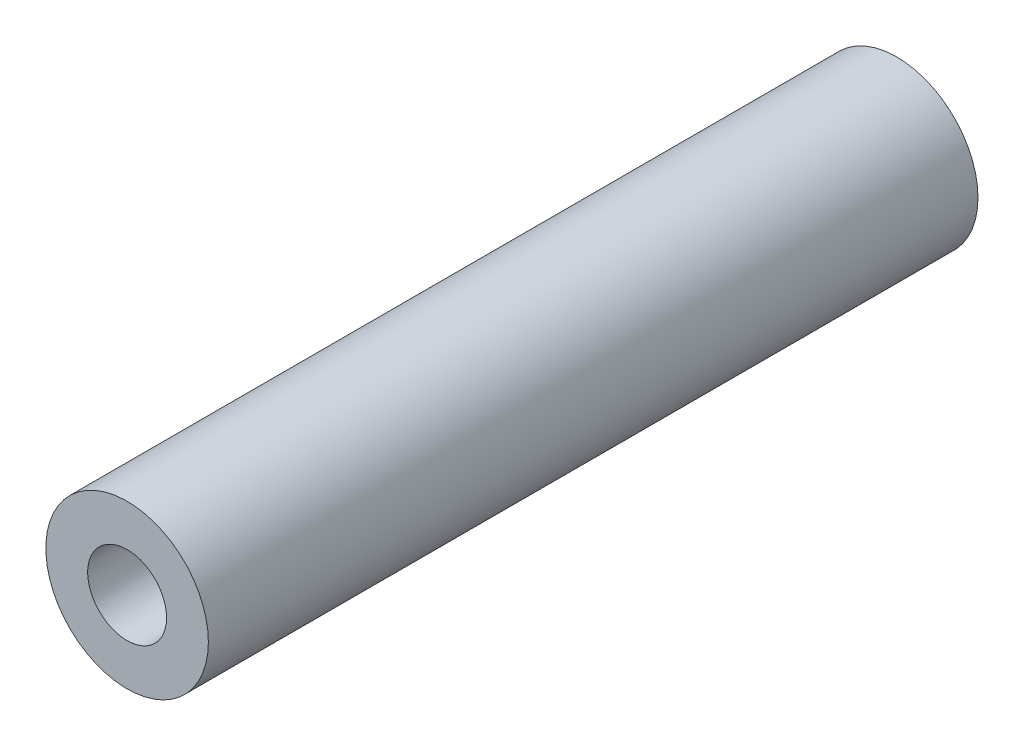
ISO-10303-21;
HEADER;
FILE_DESCRIPTION(('STEP AP214'),'2;1');
FILE_NAME('part.step','',(''),(''),'','','');
FILE_SCHEMA(('AUTOMOTIVE_DESIGN { 1 0 10303 214 1 1 1 1 }'));
ENDSEC;
DATA;
#1=APPLICATION_CONTEXT('core data for automotive mechanical design processes');
#2=APPLICATION_PROTOCOL_DEFINITION('international standard','automotive_design',2000,#1);
#3=PRODUCT_CONTEXT('',#1,'mechanical');
#4=PRODUCT('Part','Part','',(#3));
#5=PRODUCT_RELATED_PRODUCT_CATEGORY('part','',(#4));
#6=PRODUCT_DEFINITION_FORMATION('','',#4);
#7=PRODUCT_DEFINITION_CONTEXT('part definition',#1,'design');
#8=PRODUCT_DEFINITION('design','',#6,#7);
#9=PRODUCT_DEFINITION_SHAPE('','',#8);
#10=(LENGTH_UNIT() NAMED_UNIT(*) SI_UNIT(.MILLI.,.METRE.));
#11=(NAMED_UNIT(*) PLANE_ANGLE_UNIT() SI_UNIT($,.RADIAN.));
#12=(NAMED_UNIT(*) SI_UNIT($,.STERADIAN.) SOLID_ANGLE_UNIT());
#13=UNCERTAINTY_MEASURE_WITH_UNIT(LENGTH_MEASURE(1.E-05),#10,'distance_accuracy_value','');
#14=(GEOMETRIC_REPRESENTATION_CONTEXT(3) GLOBAL_UNCERTAINTY_ASSIGNED_CONTEXT((#13)) GLOBAL_UNIT_ASSIGNED_CONTEXT((#10,
#11,#12)) REPRESENTATION_CONTEXT('',''));
#15=CARTESIAN_POINT('',(0.,0.,0.));
#16=DIRECTION('',(0.,0.,1.));
#17=DIRECTION('',(1.,0.,0.));
#18=AXIS2_PLACEMENT_3D('',#15,#16,#17);
#19=CARTESIAN_POINT('',(0.,0.,32.2));
#20=DIRECTION('',(0.,0.,1.));
#21=DIRECTION('',(1.,0.,0.));
#22=AXIS2_PLACEMENT_3D('',#19,#20,#21);
#23=PLANE('',#22);
#24=CARTESIAN_POINT('',(0.,0.,32.2));
#25=DIRECTION('',(0.,0.,1.));
#26=DIRECTION('',(1.,0.,0.));
#27=AXIS2_PLACEMENT_3D('',#24,#25,#26);
#28=CIRCLE('',#27,3.4);
#29=CARTESIAN_POINT('',(3.4,0.,32.2));
#30=VERTEX_POINT('',#29);
#31=EDGE_CURVE('E10',#30,#30,#28,.T.);
#32=ORIENTED_EDGE('',*,*,#31,.T.);
#33=EDGE_LOOP('',(#32));
#34=FACE_BOUND('',#33,.T.);
#35=CARTESIAN_POINT('',(0.,0.,32.2));
#36=DIRECTION('',(0.,0.,1.));
#37=DIRECTION('',(1.,0.,0.));
#38=AXIS2_PLACEMENT_3D('',#35,#36,#37);
#39=CIRCLE('',#38,1.65);
#40=CARTESIAN_POINT('',(1.65,0.,32.2));
#41=VERTEX_POINT('',#40);
#42=EDGE_CURVE('E56',#41,#41,#39,.T.);
#43=ORIENTED_EDGE('',*,*,#42,.F.);
#44=EDGE_LOOP('',(#43));
#45=FACE_BOUND('',#44,.T.);
#46=ADVANCED_FACE('F43',(#34,#45),#23,.T.);
#47=CARTESIAN_POINT('',(0.,0.,0.));
#48=DIRECTION('',(0.,0.,1.));
#49=DIRECTION('',(1.,0.,0.));
#50=AXIS2_PLACEMENT_3D('',#47,#48,#49);
#51=PLANE('',#50);
#52=CARTESIAN_POINT('',(0.,0.,0.));
#53=DIRECTION('',(0.,0.,1.));
#54=DIRECTION('',(1.,0.,0.));
#55=AXIS2_PLACEMENT_3D('',#52,#53,#54);
#56=CIRCLE('',#55,3.4);
#57=CARTESIAN_POINT('',(3.4,0.,0.));
#58=VERTEX_POINT('',#57);
#59=EDGE_CURVE('E47',#58,#58,#56,.T.);
#60=ORIENTED_EDGE('',*,*,#59,.F.);
#61=EDGE_LOOP('',(#60));
#62=FACE_BOUND('',#61,.T.);
#63=CARTESIAN_POINT('',(0.,0.,0.));
#64=DIRECTION('',(0.,0.,1.));
#65=DIRECTION('',(1.,0.,0.));
#66=AXIS2_PLACEMENT_3D('',#63,#64,#65);
#67=CIRCLE('',#66,1.65);
#68=CARTESIAN_POINT('',(1.65,0.,0.));
#69=VERTEX_POINT('',#68);
#70=EDGE_CURVE('E58',#69,#69,#67,.T.);
#71=ORIENTED_EDGE('',*,*,#70,.T.);
#72=EDGE_LOOP('',(#71));
#73=FACE_BOUND('',#72,.T.);
#74=ADVANCED_FACE('F70',(#62,#73),#51,.F.);
#75=CARTESIAN_POINT('',(0.,0.,32.2));
#76=DIRECTION('',(0.,0.,-1.));
#77=DIRECTION('',(-1.,0.,0.));
#78=AXIS2_PLACEMENT_3D('',#75,#76,#77);
#79=CYLINDRICAL_SURFACE('',#78,3.4);
#80=ORIENTED_EDGE('',*,*,#31,.F.);
#81=EDGE_LOOP('',(#80));
#82=FACE_BOUND('',#81,.T.);
#83=ORIENTED_EDGE('',*,*,#59,.T.);
#84=EDGE_LOOP('',(#83));
#85=FACE_BOUND('',#84,.T.);
#86=ADVANCED_FACE('F45',(#82,#85),#79,.T.);
#87=CARTESIAN_POINT('',(0.,0.,32.2));
#88=DIRECTION('',(0.,0.,-1.));
#89=DIRECTION('',(-1.,0.,0.));
#90=AXIS2_PLACEMENT_3D('',#87,#88,#89);
#91=CYLINDRICAL_SURFACE('',#90,1.65);
#92=ORIENTED_EDGE('',*,*,#42,.T.);
#93=EDGE_LOOP('',(#92));
#94=FACE_BOUND('',#93,.T.);
#95=ORIENTED_EDGE('',*,*,#70,.F.);
#96=EDGE_LOOP('',(#95));
#97=FACE_BOUND('',#96,.T.);
#98=ADVANCED_FACE('F66',(#94,#97),#91,.F.);
#99=CLOSED_SHELL('',(#46,#74,#86,#98));
#100=MANIFOLD_SOLID_BREP('B2',#99);
#101=ADVANCED_BREP_SHAPE_REPRESENTATION('',(#18,#100),#14);
#102=SHAPE_DEFINITION_REPRESENTATION(#9,#101);
ENDSEC;
END-ISO-10303-21;
